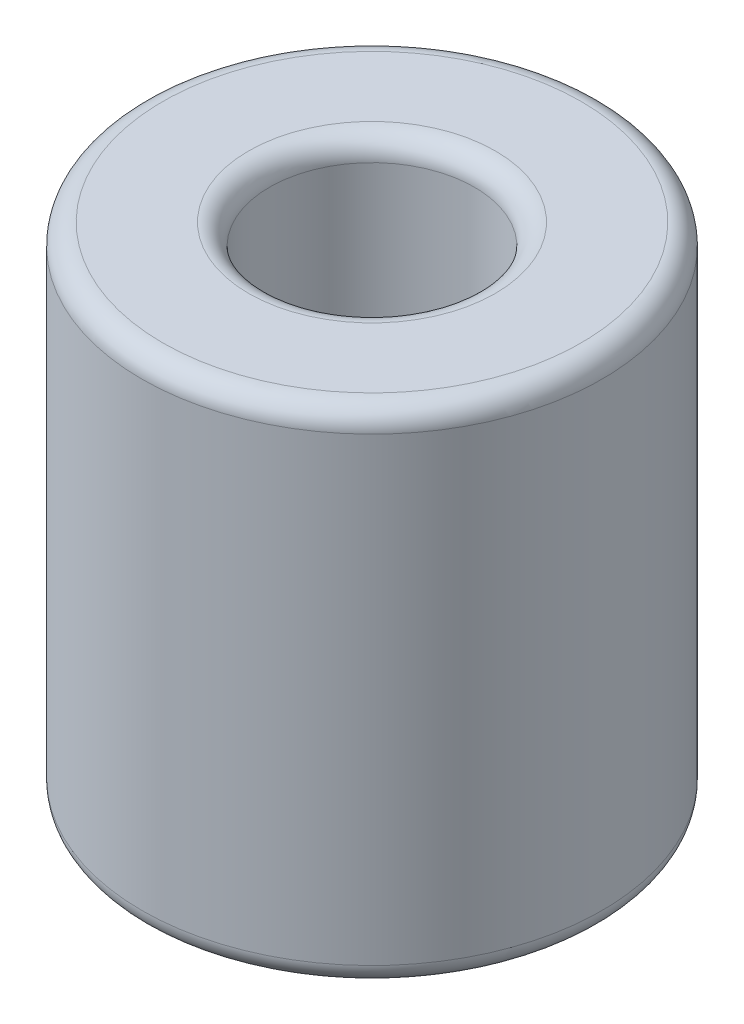
ISO-10303-21;
HEADER;
FILE_DESCRIPTION(('STEP AP214'),'2;1');
FILE_NAME('part.step','',(''),(''),'','','');
FILE_SCHEMA(('AUTOMOTIVE_DESIGN { 1 0 10303 214 1 1 1 1 }'));
ENDSEC;
DATA;
#1=APPLICATION_CONTEXT('core data for automotive mechanical design processes');
#2=APPLICATION_PROTOCOL_DEFINITION('international standard','automotive_design',2000,#1);
#3=PRODUCT_CONTEXT('',#1,'mechanical');
#4=PRODUCT('Part','Part','',(#3));
#5=PRODUCT_RELATED_PRODUCT_CATEGORY('part','',(#4));
#6=PRODUCT_DEFINITION_FORMATION('','',#4);
#7=PRODUCT_DEFINITION_CONTEXT('part definition',#1,'design');
#8=PRODUCT_DEFINITION('design','',#6,#7);
#9=PRODUCT_DEFINITION_SHAPE('','',#8);
#10=(LENGTH_UNIT() NAMED_UNIT(*) SI_UNIT(.MILLI.,.METRE.));
#11=(NAMED_UNIT(*) PLANE_ANGLE_UNIT() SI_UNIT($,.RADIAN.));
#12=(NAMED_UNIT(*) SI_UNIT($,.STERADIAN.) SOLID_ANGLE_UNIT());
#13=UNCERTAINTY_MEASURE_WITH_UNIT(LENGTH_MEASURE(1.E-05),#10,'distance_accuracy_value','');
#14=(GEOMETRIC_REPRESENTATION_CONTEXT(3) GLOBAL_UNCERTAINTY_ASSIGNED_CONTEXT((#13)) GLOBAL_UNIT_ASSIGNED_CONTEXT((#10,
#11,#12)) REPRESENTATION_CONTEXT('',''));
#15=CARTESIAN_POINT('',(0.,0.,0.));
#16=DIRECTION('',(0.,0.,1.));
#17=DIRECTION('',(1.,0.,0.));
#18=AXIS2_PLACEMENT_3D('',#15,#16,#17);
#19=CARTESIAN_POINT('',(0.,12.,0.));
#20=DIRECTION('',(0.,1.,0.));
#21=DIRECTION('',(0.,0.,1.));
#22=AXIS2_PLACEMENT_3D('',#19,#20,#21);
#23=PLANE('',#22);
#24=CARTESIAN_POINT('',(0.,12.,0.));
#25=DIRECTION('',(0.,1.,0.));
#26=DIRECTION('',(0.,0.,1.));
#27=AXIS2_PLACEMENT_3D('',#24,#25,#26);
#28=CIRCLE('',#27,5.);
#29=CARTESIAN_POINT('',(0.,12.,5.));
#30=VERTEX_POINT('',#29);
#31=EDGE_CURVE('E10',#30,#30,#28,.T.);
#32=ORIENTED_EDGE('',*,*,#31,.T.);
#33=EDGE_LOOP('',(#32));
#34=FACE_BOUND('',#33,.T.);
#35=CARTESIAN_POINT('',(0.,12.,0.));
#36=DIRECTION('',(0.,1.,0.));
#37=DIRECTION('',(0.,0.,1.));
#38=AXIS2_PLACEMENT_3D('',#35,#36,#37);
#39=CIRCLE('',#38,2.95);
#40=CARTESIAN_POINT('',(0.,12.,2.95));
#41=VERTEX_POINT('',#40);
#42=EDGE_CURVE('E47',#41,#41,#39,.F.);
#43=ORIENTED_EDGE('',*,*,#42,.T.);
#44=EDGE_LOOP('',(#43));
#45=FACE_BOUND('',#44,.T.);
#46=ADVANCED_FACE('F39',(#34,#45),#23,.T.);
#47=CARTESIAN_POINT('',(0.,0.,0.));
#48=DIRECTION('',(0.,1.,0.));
#49=DIRECTION('',(0.,0.,1.));
#50=AXIS2_PLACEMENT_3D('',#47,#48,#49);
#51=PLANE('',#50);
#52=CARTESIAN_POINT('',(0.,0.,0.));
#53=DIRECTION('',(0.,1.,0.));
#54=DIRECTION('',(0.,0.,1.));
#55=AXIS2_PLACEMENT_3D('',#52,#53,#54);
#56=CIRCLE('',#55,2.95);
#57=CARTESIAN_POINT('',(0.,0.,2.95));
#58=VERTEX_POINT('',#57);
#59=EDGE_CURVE('E71',#58,#58,#56,.T.);
#60=ORIENTED_EDGE('',*,*,#59,.T.);
#61=EDGE_LOOP('',(#60));
#62=FACE_BOUND('',#61,.T.);
#63=CARTESIAN_POINT('',(0.,0.,0.));
#64=DIRECTION('',(0.,1.,0.));
#65=DIRECTION('',(0.,0.,1.));
#66=AXIS2_PLACEMENT_3D('',#63,#64,#65);
#67=CIRCLE('',#66,5.);
#68=CARTESIAN_POINT('',(0.,0.,5.));
#69=VERTEX_POINT('',#68);
#70=EDGE_CURVE('E75',#69,#69,#67,.F.);
#71=ORIENTED_EDGE('',*,*,#70,.T.);
#72=EDGE_LOOP('',(#71));
#73=FACE_BOUND('',#72,.T.);
#74=ADVANCED_FACE('F80',(#62,#73),#51,.F.);
#75=CARTESIAN_POINT('',(0.,12.,0.));
#76=DIRECTION('',(0.,-1.,0.));
#77=DIRECTION('',(0.,0.,-1.));
#78=AXIS2_PLACEMENT_3D('',#75,#76,#77);
#79=CYLINDRICAL_SURFACE('',#78,5.5);
#80=CARTESIAN_POINT('',(0.,0.5,0.));
#81=DIRECTION('',(0.,1.,0.));
#82=DIRECTION('',(0.,0.,1.));
#83=AXIS2_PLACEMENT_3D('',#80,#81,#82);
#84=CIRCLE('',#83,5.5);
#85=CARTESIAN_POINT('',(0.,0.5,5.5));
#86=VERTEX_POINT('',#85);
#87=EDGE_CURVE('E52',#86,#86,#84,.T.);
#88=ORIENTED_EDGE('',*,*,#87,.T.);
#89=EDGE_LOOP('',(#88));
#90=FACE_BOUND('',#89,.T.);
#91=CARTESIAN_POINT('',(0.,11.5,0.));
#92=DIRECTION('',(0.,1.,0.));
#93=DIRECTION('',(0.,0.,1.));
#94=AXIS2_PLACEMENT_3D('',#91,#92,#93);
#95=CIRCLE('',#94,5.5);
#96=CARTESIAN_POINT('',(0.,11.5,5.5));
#97=VERTEX_POINT('',#96);
#98=EDGE_CURVE('E57',#97,#97,#95,.F.);
#99=ORIENTED_EDGE('',*,*,#98,.T.);
#100=EDGE_LOOP('',(#99));
#101=FACE_BOUND('',#100,.T.);
#102=ADVANCED_FACE('F90',(#90,#101),#79,.T.);
#103=CARTESIAN_POINT('',(0.,12.,0.));
#104=DIRECTION('',(0.,-1.,0.));
#105=DIRECTION('',(0.,0.,-1.));
#106=AXIS2_PLACEMENT_3D('',#103,#104,#105);
#107=CYLINDRICAL_SURFACE('',#106,2.45);
#108=CARTESIAN_POINT('',(0.,0.5,0.));
#109=DIRECTION('',(0.,1.,0.));
#110=DIRECTION('',(0.,0.,1.));
#111=AXIS2_PLACEMENT_3D('',#108,#109,#110);
#112=CIRCLE('',#111,2.45);
#113=CARTESIAN_POINT('',(0.,0.5,2.45));
#114=VERTEX_POINT('',#113);
#115=EDGE_CURVE('E63',#114,#114,#112,.F.);
#116=ORIENTED_EDGE('',*,*,#115,.T.);
#117=EDGE_LOOP('',(#116));
#118=FACE_BOUND('',#117,.T.);
#119=CARTESIAN_POINT('',(0.,11.5,0.));
#120=DIRECTION('',(0.,1.,0.));
#121=DIRECTION('',(0.,0.,1.));
#122=AXIS2_PLACEMENT_3D('',#119,#120,#121);
#123=CIRCLE('',#122,2.45);
#124=CARTESIAN_POINT('',(0.,11.5,2.45));
#125=VERTEX_POINT('',#124);
#126=EDGE_CURVE('E67',#125,#125,#123,.T.);
#127=ORIENTED_EDGE('',*,*,#126,.T.);
#128=EDGE_LOOP('',(#127));
#129=FACE_BOUND('',#128,.T.);
#130=ADVANCED_FACE('F93',(#118,#129),#107,.F.);
#131=CARTESIAN_POINT('',(0.,0.5,0.));
#132=DIRECTION('',(0.,1.,0.));
#133=DIRECTION('',(0.,0.,1.));
#134=AXIS2_PLACEMENT_3D('',#131,#132,#133);
#135=TOROIDAL_SURFACE('',#134,2.95,0.5);
#136=ORIENTED_EDGE('',*,*,#115,.F.);
#137=EDGE_LOOP('',(#136));
#138=FACE_BOUND('',#137,.T.);
#139=ORIENTED_EDGE('',*,*,#59,.F.);
#140=EDGE_LOOP('',(#139));
#141=FACE_BOUND('',#140,.T.);
#142=ADVANCED_FACE('F86',(#138,#141),#135,.T.);
#143=CARTESIAN_POINT('',(0.,0.5,0.));
#144=DIRECTION('',(0.,1.,0.));
#145=DIRECTION('',(0.,0.,1.));
#146=AXIS2_PLACEMENT_3D('',#143,#144,#145);
#147=TOROIDAL_SURFACE('',#146,5.,0.5);
#148=ORIENTED_EDGE('',*,*,#70,.F.);
#149=EDGE_LOOP('',(#148));
#150=FACE_BOUND('',#149,.T.);
#151=ORIENTED_EDGE('',*,*,#87,.F.);
#152=EDGE_LOOP('',(#151));
#153=FACE_BOUND('',#152,.T.);
#154=ADVANCED_FACE('F82',(#150,#153),#147,.T.);
#155=CARTESIAN_POINT('',(0.,11.5,0.));
#156=DIRECTION('',(0.,1.,0.));
#157=DIRECTION('',(0.,0.,1.));
#158=AXIS2_PLACEMENT_3D('',#155,#156,#157);
#159=TOROIDAL_SURFACE('',#158,5.,0.5);
#160=ORIENTED_EDGE('',*,*,#98,.F.);
#161=EDGE_LOOP('',(#160));
#162=FACE_BOUND('',#161,.T.);
#163=ORIENTED_EDGE('',*,*,#31,.F.);
#164=EDGE_LOOP('',(#163));
#165=FACE_BOUND('',#164,.T.);
#166=ADVANCED_FACE('F85',(#162,#165),#159,.T.);
#167=CARTESIAN_POINT('',(0.,11.5,0.));
#168=DIRECTION('',(0.,1.,0.));
#169=DIRECTION('',(0.,0.,1.));
#170=AXIS2_PLACEMENT_3D('',#167,#168,#169);
#171=TOROIDAL_SURFACE('',#170,2.95,0.5);
#172=ORIENTED_EDGE('',*,*,#42,.F.);
#173=EDGE_LOOP('',(#172));
#174=FACE_BOUND('',#173,.T.);
#175=ORIENTED_EDGE('',*,*,#126,.F.);
#176=EDGE_LOOP('',(#175));
#177=FACE_BOUND('',#176,.T.);
#178=ADVANCED_FACE('F41',(#174,#177),#171,.T.);
#179=CLOSED_SHELL('',(#46,#74,#102,#130,#142,#154,#166,#178));
#180=MANIFOLD_SOLID_BREP('B2',#179);
#181=ADVANCED_BREP_SHAPE_REPRESENTATION('',(#18,#180),#14);
#182=SHAPE_DEFINITION_REPRESENTATION(#9,#181);
ENDSEC;
END-ISO-10303-21;
